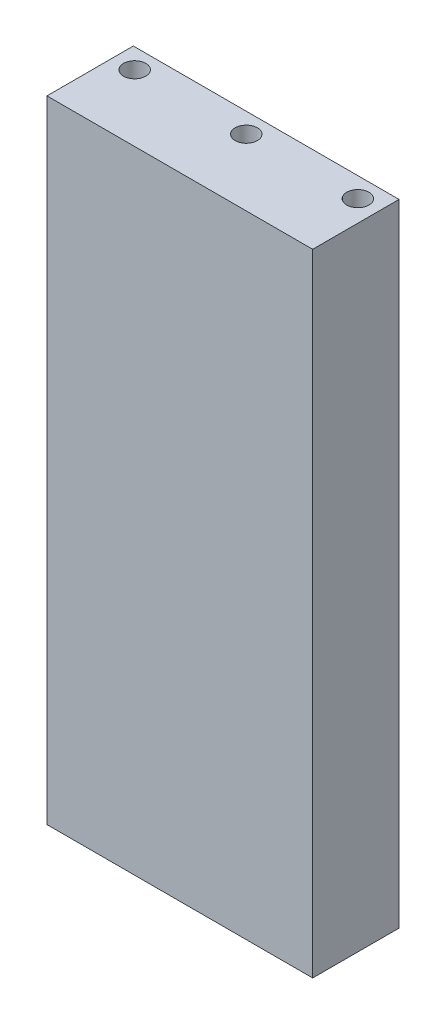
ISO-10303-21;
HEADER;
FILE_DESCRIPTION(('STEP AP214'),'2;1');
FILE_NAME('part.step','',(''),(''),'','','');
FILE_SCHEMA(('AUTOMOTIVE_DESIGN { 1 0 10303 214 1 1 1 1 }'));
ENDSEC;
DATA;
#1=APPLICATION_CONTEXT('core data for automotive mechanical design processes');
#2=APPLICATION_PROTOCOL_DEFINITION('international standard','automotive_design',2000,#1);
#3=PRODUCT_CONTEXT('',#1,'mechanical');
#4=PRODUCT('Part','Part','',(#3));
#5=PRODUCT_RELATED_PRODUCT_CATEGORY('part','',(#4));
#6=PRODUCT_DEFINITION_FORMATION('','',#4);
#7=PRODUCT_DEFINITION_CONTEXT('part definition',#1,'design');
#8=PRODUCT_DEFINITION('design','',#6,#7);
#9=PRODUCT_DEFINITION_SHAPE('','',#8);
#10=(LENGTH_UNIT() NAMED_UNIT(*) SI_UNIT(.MILLI.,.METRE.));
#11=(NAMED_UNIT(*) PLANE_ANGLE_UNIT() SI_UNIT($,.RADIAN.));
#12=(NAMED_UNIT(*) SI_UNIT($,.STERADIAN.) SOLID_ANGLE_UNIT());
#13=UNCERTAINTY_MEASURE_WITH_UNIT(LENGTH_MEASURE(1.E-05),#10,'distance_accuracy_value','');
#14=(GEOMETRIC_REPRESENTATION_CONTEXT(3) GLOBAL_UNCERTAINTY_ASSIGNED_CONTEXT((#13)) GLOBAL_UNIT_ASSIGNED_CONTEXT((#10,
#11,#12)) REPRESENTATION_CONTEXT('',''));
#15=CARTESIAN_POINT('',(0.,0.,0.));
#16=DIRECTION('',(0.,0.,1.));
#17=DIRECTION('',(1.,0.,0.));
#18=AXIS2_PLACEMENT_3D('',#15,#16,#17);
#19=CARTESIAN_POINT('',(0.,60.325,0.));
#20=DIRECTION('',(0.,1.,0.));
#21=DIRECTION('',(0.,0.,1.));
#22=AXIS2_PLACEMENT_3D('',#19,#20,#21);
#23=PLANE('',#22);
#24=CARTESIAN_POINT('',(-9.07961751151828,60.325,-57.0448338191956));
#25=DIRECTION('',(0.,1.,0.));
#26=DIRECTION('',(0.,0.,1.));
#27=AXIS2_PLACEMENT_3D('',#24,#25,#26);
#28=CIRCLE('',#27,2.12725);
#29=CARTESIAN_POINT('',(-9.07961751151828,60.325,-59.1720838191956));
#30=VERTEX_POINT('',#29);
#31=EDGE_CURVE('E108',#30,#30,#28,.T.);
#32=ORIENTED_EDGE('',*,*,#31,.F.);
#33=EDGE_LOOP('',(#32));
#34=FACE_BOUND('',#33,.T.);
#35=DIRECTION('',(0.,0.,-1.));
#36=VECTOR('',#35,1.);
#37=CARTESIAN_POINT('',(16.3203824884817,60.325,-60.8548338191956));
#38=LINE('',#37,#36);
#39=CARTESIAN_POINT('',(16.3203824884817,60.325,-44.3448338191956));
#40=VERTEX_POINT('',#39);
#41=CARTESIAN_POINT('',(16.3203824884817,60.325,-60.8548338191956));
#42=VERTEX_POINT('',#41);
#43=EDGE_CURVE('E71',#40,#42,#38,.T.);
#44=ORIENTED_EDGE('',*,*,#43,.T.);
#45=DIRECTION('',(-1.,0.,0.));
#46=VECTOR('',#45,1.);
#47=CARTESIAN_POINT('',(-34.4796175115183,60.325,-60.8548338191956));
#48=LINE('',#47,#46);
#49=CARTESIAN_POINT('',(-34.4796175115183,60.325,-60.8548338191956));
#50=VERTEX_POINT('',#49);
#51=EDGE_CURVE('E53',#42,#50,#48,.T.);
#52=ORIENTED_EDGE('',*,*,#51,.T.);
#53=DIRECTION('',(0.,0.,1.));
#54=VECTOR('',#53,1.);
#55=CARTESIAN_POINT('',(-34.4796175115183,60.325,-60.8548338191956));
#56=LINE('',#55,#54);
#57=CARTESIAN_POINT('',(-34.4796175115183,60.325,-44.3448338191956));
#58=VERTEX_POINT('',#57);
#59=EDGE_CURVE('E121',#50,#58,#56,.T.);
#60=ORIENTED_EDGE('',*,*,#59,.T.);
#61=DIRECTION('',(1.,0.,0.));
#62=VECTOR('',#61,1.);
#63=CARTESIAN_POINT('',(0.,60.325,-44.3448338191956));
#64=LINE('',#63,#62);
#65=EDGE_CURVE('E92',#58,#40,#64,.T.);
#66=ORIENTED_EDGE('',*,*,#65,.T.);
#67=EDGE_LOOP('',(#44,#52,#60,#66));
#68=FACE_BOUND('',#67,.T.);
#69=CARTESIAN_POINT('',(-30.4156175115183,60.325,-57.0448338191956));
#70=DIRECTION('',(0.,1.,0.));
#71=DIRECTION('',(0.,0.,1.));
#72=AXIS2_PLACEMENT_3D('',#69,#70,#71);
#73=CIRCLE('',#72,2.12725);
#74=CARTESIAN_POINT('',(-30.4156175115183,60.325,-59.1720838191956));
#75=VERTEX_POINT('',#74);
#76=EDGE_CURVE('E85',#75,#75,#73,.T.);
#77=ORIENTED_EDGE('',*,*,#76,.F.);
#78=EDGE_LOOP('',(#77));
#79=FACE_BOUND('',#78,.T.);
#80=CARTESIAN_POINT('',(12.2563824884817,60.325,-57.0448338191956));
#81=DIRECTION('',(0.,1.,0.));
#82=DIRECTION('',(0.,0.,1.));
#83=AXIS2_PLACEMENT_3D('',#80,#81,#82);
#84=CIRCLE('',#83,2.12725);
#85=CARTESIAN_POINT('',(12.2563824884817,60.325,-59.1720838191956));
#86=VERTEX_POINT('',#85);
#87=EDGE_CURVE('E102',#86,#86,#84,.T.);
#88=ORIENTED_EDGE('',*,*,#87,.F.);
#89=EDGE_LOOP('',(#88));
#90=FACE_BOUND('',#89,.T.);
#91=ADVANCED_FACE('F36',(#34,#68,#79,#90),#23,.T.);
#92=CARTESIAN_POINT('',(0.,-60.325,0.));
#93=DIRECTION('',(0.,1.,0.));
#94=DIRECTION('',(0.,0.,1.));
#95=AXIS2_PLACEMENT_3D('',#92,#93,#94);
#96=PLANE('',#95);
#97=DIRECTION('',(0.,0.,-1.));
#98=VECTOR('',#97,1.);
#99=CARTESIAN_POINT('',(16.3203824884817,-60.325,-60.8548338191956));
#100=LINE('',#99,#98);
#101=CARTESIAN_POINT('',(16.3203824884817,-60.325,-44.3448338191956));
#102=VERTEX_POINT('',#101);
#103=CARTESIAN_POINT('',(16.3203824884817,-60.325,-60.8548338191956));
#104=VERTEX_POINT('',#103);
#105=EDGE_CURVE('E80',#102,#104,#100,.T.);
#106=ORIENTED_EDGE('',*,*,#105,.F.);
#107=DIRECTION('',(1.,0.,0.));
#108=VECTOR('',#107,1.);
#109=CARTESIAN_POINT('',(0.,-60.325,-44.3448338191956));
#110=LINE('',#109,#108);
#111=CARTESIAN_POINT('',(-34.4796175115183,-60.325,-44.3448338191956));
#112=VERTEX_POINT('',#111);
#113=EDGE_CURVE('E84',#112,#102,#110,.T.);
#114=ORIENTED_EDGE('',*,*,#113,.F.);
#115=DIRECTION('',(0.,0.,1.));
#116=VECTOR('',#115,1.);
#117=CARTESIAN_POINT('',(-34.4796175115183,-60.325,-60.8548338191956));
#118=LINE('',#117,#116);
#119=CARTESIAN_POINT('',(-34.4796175115183,-60.325,-60.8548338191956));
#120=VERTEX_POINT('',#119);
#121=EDGE_CURVE('E119',#120,#112,#118,.T.);
#122=ORIENTED_EDGE('',*,*,#121,.F.);
#123=DIRECTION('',(-1.,0.,0.));
#124=VECTOR('',#123,1.);
#125=CARTESIAN_POINT('',(-34.4796175115183,-60.325,-60.8548338191956));
#126=LINE('',#125,#124);
#127=EDGE_CURVE('E64',#104,#120,#126,.T.);
#128=ORIENTED_EDGE('',*,*,#127,.F.);
#129=EDGE_LOOP('',(#106,#114,#122,#128));
#130=FACE_BOUND('',#129,.T.);
#131=CARTESIAN_POINT('',(-30.4156175115183,-60.325,-57.0448338191956));
#132=DIRECTION('',(0.,1.,0.));
#133=DIRECTION('',(0.,0.,1.));
#134=AXIS2_PLACEMENT_3D('',#131,#132,#133);
#135=CIRCLE('',#134,2.12725);
#136=CARTESIAN_POINT('',(-30.4156175115183,-60.325,-59.1720838191956));
#137=VERTEX_POINT('',#136);
#138=EDGE_CURVE('E111',#137,#137,#135,.T.);
#139=ORIENTED_EDGE('',*,*,#138,.T.);
#140=EDGE_LOOP('',(#139));
#141=FACE_BOUND('',#140,.T.);
#142=CARTESIAN_POINT('',(-9.07961751151828,-60.325,-57.0448338191956));
#143=DIRECTION('',(0.,1.,0.));
#144=DIRECTION('',(0.,0.,1.));
#145=AXIS2_PLACEMENT_3D('',#142,#143,#144);
#146=CIRCLE('',#145,2.12725);
#147=CARTESIAN_POINT('',(-9.07961751151828,-60.325,-59.1720838191956));
#148=VERTEX_POINT('',#147);
#149=EDGE_CURVE('E105',#148,#148,#146,.T.);
#150=ORIENTED_EDGE('',*,*,#149,.T.);
#151=EDGE_LOOP('',(#150));
#152=FACE_BOUND('',#151,.T.);
#153=CARTESIAN_POINT('',(12.2563824884817,-60.325,-57.0448338191956));
#154=DIRECTION('',(0.,1.,0.));
#155=DIRECTION('',(0.,0.,1.));
#156=AXIS2_PLACEMENT_3D('',#153,#154,#155);
#157=CIRCLE('',#156,2.12725);
#158=CARTESIAN_POINT('',(12.2563824884817,-60.325,-59.1720838191956));
#159=VERTEX_POINT('',#158);
#160=EDGE_CURVE('E101',#159,#159,#157,.T.);
#161=ORIENTED_EDGE('',*,*,#160,.T.);
#162=EDGE_LOOP('',(#161));
#163=FACE_BOUND('',#162,.T.);
#164=ADVANCED_FACE('F81',(#130,#141,#152,#163),#96,.F.);
#165=CARTESIAN_POINT('',(16.3203824884817,60.325,-60.8548338191956));
#166=DIRECTION('',(-1.,0.,0.));
#167=DIRECTION('',(0.,0.,1.));
#168=AXIS2_PLACEMENT_3D('',#165,#166,#167);
#169=PLANE('',#168);
#170=ORIENTED_EDGE('',*,*,#105,.T.);
#171=DIRECTION('',(0.,-1.,0.));
#172=VECTOR('',#171,1.);
#173=CARTESIAN_POINT('',(16.3203824884817,60.325,-60.8548338191956));
#174=LINE('',#173,#172);
#175=EDGE_CURVE('E11',#42,#104,#174,.T.);
#176=ORIENTED_EDGE('',*,*,#175,.F.);
#177=ORIENTED_EDGE('',*,*,#43,.F.);
#178=DIRECTION('',(0.,-1.,0.));
#179=VECTOR('',#178,1.);
#180=CARTESIAN_POINT('',(16.3203824884817,60.325,-44.3448338191956));
#181=LINE('',#180,#179);
#182=EDGE_CURVE('E88',#40,#102,#181,.T.);
#183=ORIENTED_EDGE('',*,*,#182,.T.);
#184=EDGE_LOOP('',(#170,#176,#177,#183));
#185=FACE_BOUND('',#184,.T.);
#186=ADVANCED_FACE('F38',(#185),#169,.F.);
#187=CARTESIAN_POINT('',(-34.4796175115183,60.325,-60.8548338191956));
#188=DIRECTION('',(0.,0.,1.));
#189=DIRECTION('',(1.,0.,0.));
#190=AXIS2_PLACEMENT_3D('',#187,#188,#189);
#191=PLANE('',#190);
#192=ORIENTED_EDGE('',*,*,#127,.T.);
#193=DIRECTION('',(0.,-1.,0.));
#194=VECTOR('',#193,1.);
#195=CARTESIAN_POINT('',(-34.4796175115183,60.325,-60.8548338191956));
#196=LINE('',#195,#194);
#197=EDGE_CURVE('E45',#50,#120,#196,.T.);
#198=ORIENTED_EDGE('',*,*,#197,.F.);
#199=ORIENTED_EDGE('',*,*,#51,.F.);
#200=ORIENTED_EDGE('',*,*,#175,.T.);
#201=EDGE_LOOP('',(#192,#198,#199,#200));
#202=FACE_BOUND('',#201,.T.);
#203=ADVANCED_FACE('F129',(#202),#191,.F.);
#204=CARTESIAN_POINT('',(-34.4796175115183,60.325,-60.8548338191956));
#205=DIRECTION('',(1.,0.,0.));
#206=DIRECTION('',(0.,0.,-1.));
#207=AXIS2_PLACEMENT_3D('',#204,#205,#206);
#208=PLANE('',#207);
#209=ORIENTED_EDGE('',*,*,#121,.T.);
#210=DIRECTION('',(0.,-1.,0.));
#211=VECTOR('',#210,1.);
#212=CARTESIAN_POINT('',(-34.4796175115183,60.325,-44.3448338191956));
#213=LINE('',#212,#211);
#214=EDGE_CURVE('E91',#58,#112,#213,.T.);
#215=ORIENTED_EDGE('',*,*,#214,.F.);
#216=ORIENTED_EDGE('',*,*,#59,.F.);
#217=ORIENTED_EDGE('',*,*,#197,.T.);
#218=EDGE_LOOP('',(#209,#215,#216,#217));
#219=FACE_BOUND('',#218,.T.);
#220=ADVANCED_FACE('F127',(#219),#208,.F.);
#221=CARTESIAN_POINT('',(-30.4156175115183,60.325,-57.0448338191956));
#222=DIRECTION('',(0.,-1.,0.));
#223=DIRECTION('',(0.,0.,-1.));
#224=AXIS2_PLACEMENT_3D('',#221,#222,#223);
#225=CYLINDRICAL_SURFACE('',#224,2.12725);
#226=CARTESIAN_POINT('',(-30.4156175115183,60.325,-59.1720838191956));
#227=CARTESIAN_POINT('',(-30.4156175115183,59.0682291666667,-59.1720838191956));
#228=CARTESIAN_POINT('',(-30.4156175115183,57.8114583333333,-59.1720838191956));
#229=CARTESIAN_POINT('',(-30.4156175115183,55.2979166666667,-59.1720838191956));
#230=CARTESIAN_POINT('',(-30.4156175115183,54.0411458333333,-59.1720838191956));
#231=CARTESIAN_POINT('',(-30.4156175115183,51.5276041666667,-59.1720838191956));
#232=CARTESIAN_POINT('',(-30.4156175115183,50.2708333333333,-59.1720838191956));
#233=CARTESIAN_POINT('',(-30.4156175115183,47.7572916666667,-59.1720838191956));
#234=CARTESIAN_POINT('',(-30.4156175115183,46.5005208333333,-59.1720838191956));
#235=CARTESIAN_POINT('',(-30.4156175115183,43.9869791666667,-59.1720838191956));
#236=CARTESIAN_POINT('',(-30.4156175115183,42.7302083333333,-59.1720838191956));
#237=CARTESIAN_POINT('',(-30.4156175115183,40.2166666666667,-59.1720838191956));
#238=CARTESIAN_POINT('',(-30.4156175115183,38.9598958333333,-59.1720838191956));
#239=CARTESIAN_POINT('',(-30.4156175115183,36.4463541666667,-59.1720838191956));
#240=CARTESIAN_POINT('',(-30.4156175115183,35.1895833333333,-59.1720838191956));
#241=CARTESIAN_POINT('',(-30.4156175115183,32.6760416666667,-59.1720838191956));
#242=CARTESIAN_POINT('',(-30.4156175115183,31.4192708333333,-59.1720838191956));
#243=CARTESIAN_POINT('',(-30.4156175115183,28.9057291666667,-59.1720838191956));
#244=CARTESIAN_POINT('',(-30.4156175115183,27.6489583333333,-59.1720838191956));
#245=CARTESIAN_POINT('',(-30.4156175115183,25.1354166666667,-59.1720838191956));
#246=CARTESIAN_POINT('',(-30.4156175115183,23.8786458333333,-59.1720838191956));
#247=CARTESIAN_POINT('',(-30.4156175115183,21.3651041666667,-59.1720838191956));
#248=CARTESIAN_POINT('',(-30.4156175115183,20.1083333333333,-59.1720838191956));
#249=CARTESIAN_POINT('',(-30.4156175115183,17.5947916666667,-59.1720838191956));
#250=CARTESIAN_POINT('',(-30.4156175115183,16.3380208333333,-59.1720838191956));
#251=CARTESIAN_POINT('',(-30.4156175115183,13.8244791666667,-59.1720838191956));
#252=CARTESIAN_POINT('',(-30.4156175115183,12.5677083333333,-59.1720838191956));
#253=CARTESIAN_POINT('',(-30.4156175115183,10.0541666666667,-59.1720838191956));
#254=CARTESIAN_POINT('',(-30.4156175115183,8.79739583333333,-59.1720838191956));
#255=CARTESIAN_POINT('',(-30.4156175115183,6.28385416666667,-59.1720838191956));
#256=CARTESIAN_POINT('',(-30.4156175115183,5.02708333333333,-59.1720838191956));
#257=CARTESIAN_POINT('',(-30.4156175115183,2.51354166666667,-59.1720838191956));
#258=CARTESIAN_POINT('',(-30.4156175115183,1.25677083333333,-59.1720838191956));
#259=CARTESIAN_POINT('',(-30.4156175115183,-1.25677083333333,-59.1720838191956));
#260=CARTESIAN_POINT('',(-30.4156175115183,-2.51354166666666,-59.1720838191956));
#261=CARTESIAN_POINT('',(-30.4156175115183,-5.02708333333332,-59.1720838191956));
#262=CARTESIAN_POINT('',(-30.4156175115183,-6.28385416666666,-59.1720838191956));
#263=CARTESIAN_POINT('',(-30.4156175115183,-8.79739583333333,-59.1720838191956));
#264=CARTESIAN_POINT('',(-30.4156175115183,-10.0541666666667,-59.1720838191956));
#265=CARTESIAN_POINT('',(-30.4156175115183,-12.5677083333333,-59.1720838191956));
#266=CARTESIAN_POINT('',(-30.4156175115183,-13.8244791666667,-59.1720838191956));
#267=CARTESIAN_POINT('',(-30.4156175115183,-16.3380208333333,-59.1720838191956));
#268=CARTESIAN_POINT('',(-30.4156175115183,-17.5947916666667,-59.1720838191956));
#269=CARTESIAN_POINT('',(-30.4156175115183,-20.1083333333333,-59.1720838191956));
#270=CARTESIAN_POINT('',(-30.4156175115183,-21.3651041666667,-59.1720838191956));
#271=CARTESIAN_POINT('',(-30.4156175115183,-23.8786458333333,-59.1720838191956));
#272=CARTESIAN_POINT('',(-30.4156175115183,-25.1354166666667,-59.1720838191956));
#273=CARTESIAN_POINT('',(-30.4156175115183,-27.6489583333333,-59.1720838191956));
#274=CARTESIAN_POINT('',(-30.4156175115183,-28.9057291666667,-59.1720838191956));
#275=CARTESIAN_POINT('',(-30.4156175115183,-31.4192708333333,-59.1720838191956));
#276=CARTESIAN_POINT('',(-30.4156175115183,-32.6760416666667,-59.1720838191956));
#277=CARTESIAN_POINT('',(-30.4156175115183,-35.1895833333333,-59.1720838191956));
#278=CARTESIAN_POINT('',(-30.4156175115183,-36.4463541666667,-59.1720838191956));
#279=CARTESIAN_POINT('',(-30.4156175115183,-38.9598958333333,-59.1720838191956));
#280=CARTESIAN_POINT('',(-30.4156175115183,-40.2166666666667,-59.1720838191956));
#281=CARTESIAN_POINT('',(-30.4156175115183,-42.7302083333333,-59.1720838191956));
#282=CARTESIAN_POINT('',(-30.4156175115183,-43.9869791666667,-59.1720838191956));
#283=CARTESIAN_POINT('',(-30.4156175115183,-46.5005208333333,-59.1720838191956));
#284=CARTESIAN_POINT('',(-30.4156175115183,-47.7572916666667,-59.1720838191956));
#285=CARTESIAN_POINT('',(-30.4156175115183,-50.2708333333333,-59.1720838191956));
#286=CARTESIAN_POINT('',(-30.4156175115183,-51.5276041666667,-59.1720838191956));
#287=CARTESIAN_POINT('',(-30.4156175115183,-54.0411458333333,-59.1720838191956));
#288=CARTESIAN_POINT('',(-30.4156175115183,-55.2979166666667,-59.1720838191956));
#289=CARTESIAN_POINT('',(-30.4156175115183,-57.8114583333333,-59.1720838191956));
#290=CARTESIAN_POINT('',(-30.4156175115183,-59.0682291666667,-59.1720838191956));
#291=CARTESIAN_POINT('',(-30.4156175115183,-60.325,-59.1720838191956));
#292=B_SPLINE_CURVE_WITH_KNOTS('',3,(#226,#227,#228,#229,#230,#231,#232,#233,#234,#235,#236,
#237,#238,#239,#240,#241,#242,#243,#244,#245,#246,#247,#248,#249,#250,#251,#252,#253,#254,#255,
#256,#257,#258,#259,#260,#261,#262,#263,#264,#265,#266,#267,#268,#269,#270,#271,#272,#273,#274,
#275,#276,#277,#278,#279,#280,#281,#282,#283,#284,#285,#286,#287,#288,#289,#290,#291),
.UNSPECIFIED.,.F.,.F.,(4,2,2,2,2,2,2,2,2,2,2,2,2,2,2,2,2,2,2,2,2,2,2,2,2,2,2,2,2,2,2,2,4),(0.,
3.7703125,7.540625,11.3109375,15.08125,18.8515625,22.621875,26.3921875,30.1625,33.9328125,
37.703125,41.4734375,45.24375,49.0140625,52.784375,56.5546875,60.325,64.0953125,67.865625,
71.6359375,75.40625,79.1765625,82.946875,86.7171875,90.4875,94.2578125,98.028125,101.7984375,
105.56875,109.3390625,113.109375,116.8796875,120.65),.UNSPECIFIED.);
#293=EDGE_CURVE('BSEAM153',#75,#137,#292,.T.);
#294=ORIENTED_EDGE('',*,*,#76,.T.);
#295=ORIENTED_EDGE('',*,*,#138,.F.);
#296=ORIENTED_EDGE('',*,*,#293,.T.);
#297=ORIENTED_EDGE('',*,*,#293,.F.);
#298=EDGE_LOOP('',(#294,#296,#295,#297));
#299=FACE_BOUND('',#298,.T.);
#300=ADVANCED_FACE('F153',(#299),#225,.F.);
#301=CARTESIAN_POINT('',(-9.07961751151828,60.325,-57.0448338191956));
#302=DIRECTION('',(0.,-1.,0.));
#303=DIRECTION('',(0.,0.,-1.));
#304=AXIS2_PLACEMENT_3D('',#301,#302,#303);
#305=CYLINDRICAL_SURFACE('',#304,2.12725);
#306=CARTESIAN_POINT('',(-9.07961751151828,60.325,-59.1720838191956));
#307=CARTESIAN_POINT('',(-9.07961751151828,59.0682291666667,-59.1720838191956));
#308=CARTESIAN_POINT('',(-9.07961751151828,57.8114583333333,-59.1720838191956));
#309=CARTESIAN_POINT('',(-9.07961751151828,55.2979166666667,-59.1720838191956));
#310=CARTESIAN_POINT('',(-9.07961751151828,54.0411458333333,-59.1720838191956));
#311=CARTESIAN_POINT('',(-9.07961751151828,51.5276041666667,-59.1720838191956));
#312=CARTESIAN_POINT('',(-9.07961751151828,50.2708333333333,-59.1720838191956));
#313=CARTESIAN_POINT('',(-9.07961751151828,47.7572916666667,-59.1720838191956));
#314=CARTESIAN_POINT('',(-9.07961751151828,46.5005208333333,-59.1720838191956));
#315=CARTESIAN_POINT('',(-9.07961751151828,43.9869791666667,-59.1720838191956));
#316=CARTESIAN_POINT('',(-9.07961751151828,42.7302083333333,-59.1720838191956));
#317=CARTESIAN_POINT('',(-9.07961751151828,40.2166666666667,-59.1720838191956));
#318=CARTESIAN_POINT('',(-9.07961751151828,38.9598958333333,-59.1720838191956));
#319=CARTESIAN_POINT('',(-9.07961751151828,36.4463541666667,-59.1720838191956));
#320=CARTESIAN_POINT('',(-9.07961751151828,35.1895833333333,-59.1720838191956));
#321=CARTESIAN_POINT('',(-9.07961751151828,32.6760416666667,-59.1720838191956));
#322=CARTESIAN_POINT('',(-9.07961751151828,31.4192708333333,-59.1720838191956));
#323=CARTESIAN_POINT('',(-9.07961751151828,28.9057291666667,-59.1720838191956));
#324=CARTESIAN_POINT('',(-9.07961751151828,27.6489583333333,-59.1720838191956));
#325=CARTESIAN_POINT('',(-9.07961751151828,25.1354166666667,-59.1720838191956));
#326=CARTESIAN_POINT('',(-9.07961751151828,23.8786458333333,-59.1720838191956));
#327=CARTESIAN_POINT('',(-9.07961751151828,21.3651041666667,-59.1720838191956));
#328=CARTESIAN_POINT('',(-9.07961751151828,20.1083333333333,-59.1720838191956));
#329=CARTESIAN_POINT('',(-9.07961751151828,17.5947916666667,-59.1720838191956));
#330=CARTESIAN_POINT('',(-9.07961751151828,16.3380208333333,-59.1720838191956));
#331=CARTESIAN_POINT('',(-9.07961751151828,13.8244791666667,-59.1720838191956));
#332=CARTESIAN_POINT('',(-9.07961751151828,12.5677083333333,-59.1720838191956));
#333=CARTESIAN_POINT('',(-9.07961751151828,10.0541666666667,-59.1720838191956));
#334=CARTESIAN_POINT('',(-9.07961751151828,8.79739583333333,-59.1720838191956));
#335=CARTESIAN_POINT('',(-9.07961751151828,6.28385416666667,-59.1720838191956));
#336=CARTESIAN_POINT('',(-9.07961751151828,5.02708333333333,-59.1720838191956));
#337=CARTESIAN_POINT('',(-9.07961751151828,2.51354166666667,-59.1720838191956));
#338=CARTESIAN_POINT('',(-9.07961751151828,1.25677083333333,-59.1720838191956));
#339=CARTESIAN_POINT('',(-9.07961751151828,-1.25677083333333,-59.1720838191956));
#340=CARTESIAN_POINT('',(-9.07961751151828,-2.51354166666666,-59.1720838191956));
#341=CARTESIAN_POINT('',(-9.07961751151828,-5.02708333333332,-59.1720838191956));
#342=CARTESIAN_POINT('',(-9.07961751151828,-6.28385416666666,-59.1720838191956));
#343=CARTESIAN_POINT('',(-9.07961751151828,-8.79739583333333,-59.1720838191956));
#344=CARTESIAN_POINT('',(-9.07961751151828,-10.0541666666667,-59.1720838191956));
#345=CARTESIAN_POINT('',(-9.07961751151828,-12.5677083333333,-59.1720838191956));
#346=CARTESIAN_POINT('',(-9.07961751151828,-13.8244791666667,-59.1720838191956));
#347=CARTESIAN_POINT('',(-9.07961751151828,-16.3380208333333,-59.1720838191956));
#348=CARTESIAN_POINT('',(-9.07961751151828,-17.5947916666667,-59.1720838191956));
#349=CARTESIAN_POINT('',(-9.07961751151828,-20.1083333333333,-59.1720838191956));
#350=CARTESIAN_POINT('',(-9.07961751151828,-21.3651041666667,-59.1720838191956));
#351=CARTESIAN_POINT('',(-9.07961751151828,-23.8786458333333,-59.1720838191956));
#352=CARTESIAN_POINT('',(-9.07961751151828,-25.1354166666667,-59.1720838191956));
#353=CARTESIAN_POINT('',(-9.07961751151828,-27.6489583333333,-59.1720838191956));
#354=CARTESIAN_POINT('',(-9.07961751151828,-28.9057291666667,-59.1720838191956));
#355=CARTESIAN_POINT('',(-9.07961751151828,-31.4192708333333,-59.1720838191956));
#356=CARTESIAN_POINT('',(-9.07961751151828,-32.6760416666667,-59.1720838191956));
#357=CARTESIAN_POINT('',(-9.07961751151828,-35.1895833333333,-59.1720838191956));
#358=CARTESIAN_POINT('',(-9.07961751151828,-36.4463541666667,-59.1720838191956));
#359=CARTESIAN_POINT('',(-9.07961751151828,-38.9598958333333,-59.1720838191956));
#360=CARTESIAN_POINT('',(-9.07961751151828,-40.2166666666667,-59.1720838191956));
#361=CARTESIAN_POINT('',(-9.07961751151828,-42.7302083333333,-59.1720838191956));
#362=CARTESIAN_POINT('',(-9.07961751151828,-43.9869791666667,-59.1720838191956));
#363=CARTESIAN_POINT('',(-9.07961751151828,-46.5005208333333,-59.1720838191956));
#364=CARTESIAN_POINT('',(-9.07961751151828,-47.7572916666667,-59.1720838191956));
#365=CARTESIAN_POINT('',(-9.07961751151828,-50.2708333333333,-59.1720838191956));
#366=CARTESIAN_POINT('',(-9.07961751151828,-51.5276041666667,-59.1720838191956));
#367=CARTESIAN_POINT('',(-9.07961751151828,-54.0411458333333,-59.1720838191956));
#368=CARTESIAN_POINT('',(-9.07961751151828,-55.2979166666667,-59.1720838191956));
#369=CARTESIAN_POINT('',(-9.07961751151828,-57.8114583333333,-59.1720838191956));
#370=CARTESIAN_POINT('',(-9.07961751151828,-59.0682291666667,-59.1720838191956));
#371=CARTESIAN_POINT('',(-9.07961751151828,-60.325,-59.1720838191956));
#372=B_SPLINE_CURVE_WITH_KNOTS('',3,(#306,#307,#308,#309,#310,#311,#312,#313,#314,#315,#316,
#317,#318,#319,#320,#321,#322,#323,#324,#325,#326,#327,#328,#329,#330,#331,#332,#333,#334,#335,
#336,#337,#338,#339,#340,#341,#342,#343,#344,#345,#346,#347,#348,#349,#350,#351,#352,#353,#354,
#355,#356,#357,#358,#359,#360,#361,#362,#363,#364,#365,#366,#367,#368,#369,#370,#371),
.UNSPECIFIED.,.F.,.F.,(4,2,2,2,2,2,2,2,2,2,2,2,2,2,2,2,2,2,2,2,2,2,2,2,2,2,2,2,2,2,2,2,4),(0.,
3.7703125,7.540625,11.3109375,15.08125,18.8515625,22.621875,26.3921875,30.1625,33.9328125,
37.703125,41.4734375,45.24375,49.0140625,52.784375,56.5546875,60.325,64.0953125,67.865625,
71.6359375,75.40625,79.1765625,82.946875,86.7171875,90.4875,94.2578125,98.028125,101.7984375,
105.56875,109.3390625,113.109375,116.8796875,120.65),.UNSPECIFIED.);
#373=EDGE_CURVE('BSEAM141',#30,#148,#372,.T.);
#374=ORIENTED_EDGE('',*,*,#31,.T.);
#375=ORIENTED_EDGE('',*,*,#149,.F.);
#376=ORIENTED_EDGE('',*,*,#373,.T.);
#377=ORIENTED_EDGE('',*,*,#373,.F.);
#378=EDGE_LOOP('',(#374,#376,#375,#377));
#379=FACE_BOUND('',#378,.T.);
#380=ADVANCED_FACE('F141',(#379),#305,.F.);
#381=CARTESIAN_POINT('',(12.2563824884817,60.325,-57.0448338191956));
#382=DIRECTION('',(0.,-1.,0.));
#383=DIRECTION('',(0.,0.,-1.));
#384=AXIS2_PLACEMENT_3D('',#381,#382,#383);
#385=CYLINDRICAL_SURFACE('',#384,2.12725);
#386=CARTESIAN_POINT('',(12.2563824884817,60.325,-59.1720838191956));
#387=CARTESIAN_POINT('',(12.2563824884817,59.0682291666667,-59.1720838191956));
#388=CARTESIAN_POINT('',(12.2563824884817,57.8114583333333,-59.1720838191956));
#389=CARTESIAN_POINT('',(12.2563824884817,55.2979166666667,-59.1720838191956));
#390=CARTESIAN_POINT('',(12.2563824884817,54.0411458333333,-59.1720838191956));
#391=CARTESIAN_POINT('',(12.2563824884817,51.5276041666667,-59.1720838191956));
#392=CARTESIAN_POINT('',(12.2563824884817,50.2708333333333,-59.1720838191956));
#393=CARTESIAN_POINT('',(12.2563824884817,47.7572916666667,-59.1720838191956));
#394=CARTESIAN_POINT('',(12.2563824884817,46.5005208333333,-59.1720838191956));
#395=CARTESIAN_POINT('',(12.2563824884817,43.9869791666667,-59.1720838191956));
#396=CARTESIAN_POINT('',(12.2563824884817,42.7302083333333,-59.1720838191956));
#397=CARTESIAN_POINT('',(12.2563824884817,40.2166666666667,-59.1720838191956));
#398=CARTESIAN_POINT('',(12.2563824884817,38.9598958333333,-59.1720838191956));
#399=CARTESIAN_POINT('',(12.2563824884817,36.4463541666667,-59.1720838191956));
#400=CARTESIAN_POINT('',(12.2563824884817,35.1895833333333,-59.1720838191956));
#401=CARTESIAN_POINT('',(12.2563824884817,32.6760416666667,-59.1720838191956));
#402=CARTESIAN_POINT('',(12.2563824884817,31.4192708333333,-59.1720838191956));
#403=CARTESIAN_POINT('',(12.2563824884817,28.9057291666667,-59.1720838191956));
#404=CARTESIAN_POINT('',(12.2563824884817,27.6489583333333,-59.1720838191956));
#405=CARTESIAN_POINT('',(12.2563824884817,25.1354166666667,-59.1720838191956));
#406=CARTESIAN_POINT('',(12.2563824884817,23.8786458333333,-59.1720838191956));
#407=CARTESIAN_POINT('',(12.2563824884817,21.3651041666667,-59.1720838191956));
#408=CARTESIAN_POINT('',(12.2563824884817,20.1083333333333,-59.1720838191956));
#409=CARTESIAN_POINT('',(12.2563824884817,17.5947916666667,-59.1720838191956));
#410=CARTESIAN_POINT('',(12.2563824884817,16.3380208333333,-59.1720838191956));
#411=CARTESIAN_POINT('',(12.2563824884817,13.8244791666667,-59.1720838191956));
#412=CARTESIAN_POINT('',(12.2563824884817,12.5677083333333,-59.1720838191956));
#413=CARTESIAN_POINT('',(12.2563824884817,10.0541666666667,-59.1720838191956));
#414=CARTESIAN_POINT('',(12.2563824884817,8.79739583333333,-59.1720838191956));
#415=CARTESIAN_POINT('',(12.2563824884817,6.28385416666667,-59.1720838191956));
#416=CARTESIAN_POINT('',(12.2563824884817,5.02708333333333,-59.1720838191956));
#417=CARTESIAN_POINT('',(12.2563824884817,2.51354166666667,-59.1720838191956));
#418=CARTESIAN_POINT('',(12.2563824884817,1.25677083333333,-59.1720838191956));
#419=CARTESIAN_POINT('',(12.2563824884817,-1.25677083333333,-59.1720838191956));
#420=CARTESIAN_POINT('',(12.2563824884817,-2.51354166666666,-59.1720838191956));
#421=CARTESIAN_POINT('',(12.2563824884817,-5.02708333333332,-59.1720838191956));
#422=CARTESIAN_POINT('',(12.2563824884817,-6.28385416666666,-59.1720838191956));
#423=CARTESIAN_POINT('',(12.2563824884817,-8.79739583333333,-59.1720838191956));
#424=CARTESIAN_POINT('',(12.2563824884817,-10.0541666666667,-59.1720838191956));
#425=CARTESIAN_POINT('',(12.2563824884817,-12.5677083333333,-59.1720838191956));
#426=CARTESIAN_POINT('',(12.2563824884817,-13.8244791666667,-59.1720838191956));
#427=CARTESIAN_POINT('',(12.2563824884817,-16.3380208333333,-59.1720838191956));
#428=CARTESIAN_POINT('',(12.2563824884817,-17.5947916666667,-59.1720838191956));
#429=CARTESIAN_POINT('',(12.2563824884817,-20.1083333333333,-59.1720838191956));
#430=CARTESIAN_POINT('',(12.2563824884817,-21.3651041666667,-59.1720838191956));
#431=CARTESIAN_POINT('',(12.2563824884817,-23.8786458333333,-59.1720838191956));
#432=CARTESIAN_POINT('',(12.2563824884817,-25.1354166666667,-59.1720838191956));
#433=CARTESIAN_POINT('',(12.2563824884817,-27.6489583333333,-59.1720838191956));
#434=CARTESIAN_POINT('',(12.2563824884817,-28.9057291666667,-59.1720838191956));
#435=CARTESIAN_POINT('',(12.2563824884817,-31.4192708333333,-59.1720838191956));
#436=CARTESIAN_POINT('',(12.2563824884817,-32.6760416666667,-59.1720838191956));
#437=CARTESIAN_POINT('',(12.2563824884817,-35.1895833333333,-59.1720838191956));
#438=CARTESIAN_POINT('',(12.2563824884817,-36.4463541666667,-59.1720838191956));
#439=CARTESIAN_POINT('',(12.2563824884817,-38.9598958333333,-59.1720838191956));
#440=CARTESIAN_POINT('',(12.2563824884817,-40.2166666666667,-59.1720838191956));
#441=CARTESIAN_POINT('',(12.2563824884817,-42.7302083333333,-59.1720838191956));
#442=CARTESIAN_POINT('',(12.2563824884817,-43.9869791666667,-59.1720838191956));
#443=CARTESIAN_POINT('',(12.2563824884817,-46.5005208333333,-59.1720838191956));
#444=CARTESIAN_POINT('',(12.2563824884817,-47.7572916666667,-59.1720838191956));
#445=CARTESIAN_POINT('',(12.2563824884817,-50.2708333333333,-59.1720838191956));
#446=CARTESIAN_POINT('',(12.2563824884817,-51.5276041666667,-59.1720838191956));
#447=CARTESIAN_POINT('',(12.2563824884817,-54.0411458333333,-59.1720838191956));
#448=CARTESIAN_POINT('',(12.2563824884817,-55.2979166666667,-59.1720838191956));
#449=CARTESIAN_POINT('',(12.2563824884817,-57.8114583333333,-59.1720838191956));
#450=CARTESIAN_POINT('',(12.2563824884817,-59.0682291666667,-59.1720838191956));
#451=CARTESIAN_POINT('',(12.2563824884817,-60.325,-59.1720838191956));
#452=B_SPLINE_CURVE_WITH_KNOTS('',3,(#386,#387,#388,#389,#390,#391,#392,#393,#394,#395,#396,
#397,#398,#399,#400,#401,#402,#403,#404,#405,#406,#407,#408,#409,#410,#411,#412,#413,#414,#415,
#416,#417,#418,#419,#420,#421,#422,#423,#424,#425,#426,#427,#428,#429,#430,#431,#432,#433,#434,
#435,#436,#437,#438,#439,#440,#441,#442,#443,#444,#445,#446,#447,#448,#449,#450,#451),
.UNSPECIFIED.,.F.,.F.,(4,2,2,2,2,2,2,2,2,2,2,2,2,2,2,2,2,2,2,2,2,2,2,2,2,2,2,2,2,2,2,2,4),(0.,
3.7703125,7.540625,11.3109375,15.08125,18.8515625,22.621875,26.3921875,30.1625,33.9328125,
37.703125,41.4734375,45.24375,49.0140625,52.784375,56.5546875,60.325,64.0953125,67.865625,
71.6359375,75.40625,79.1765625,82.946875,86.7171875,90.4875,94.2578125,98.028125,101.7984375,
105.56875,109.3390625,113.109375,116.8796875,120.65),.UNSPECIFIED.);
#453=EDGE_CURVE('BSEAM138',#86,#159,#452,.T.);
#454=ORIENTED_EDGE('',*,*,#87,.T.);
#455=ORIENTED_EDGE('',*,*,#160,.F.);
#456=ORIENTED_EDGE('',*,*,#453,.T.);
#457=ORIENTED_EDGE('',*,*,#453,.F.);
#458=EDGE_LOOP('',(#454,#456,#455,#457));
#459=FACE_BOUND('',#458,.T.);
#460=ADVANCED_FACE('F138',(#459),#385,.F.);
#461=CARTESIAN_POINT('',(0.,60.325,-44.3448338191956));
#462=DIRECTION('',(0.,0.,-1.));
#463=DIRECTION('',(-1.,0.,0.));
#464=AXIS2_PLACEMENT_3D('',#461,#462,#463);
#465=PLANE('',#464);
#466=ORIENTED_EDGE('',*,*,#113,.T.);
#467=ORIENTED_EDGE('',*,*,#182,.F.);
#468=ORIENTED_EDGE('',*,*,#65,.F.);
#469=ORIENTED_EDGE('',*,*,#214,.T.);
#470=EDGE_LOOP('',(#466,#467,#468,#469));
#471=FACE_BOUND('',#470,.T.);
#472=ADVANCED_FACE('F95',(#471),#465,.F.);
#473=CLOSED_SHELL('',(#91,#164,#186,#203,#220,#300,#380,#460,#472));
#474=MANIFOLD_SOLID_BREP('B2',#473);
#475=ADVANCED_BREP_SHAPE_REPRESENTATION('',(#18,#474),#14);
#476=SHAPE_DEFINITION_REPRESENTATION(#9,#475);
ENDSEC;
END-ISO-10303-21;
